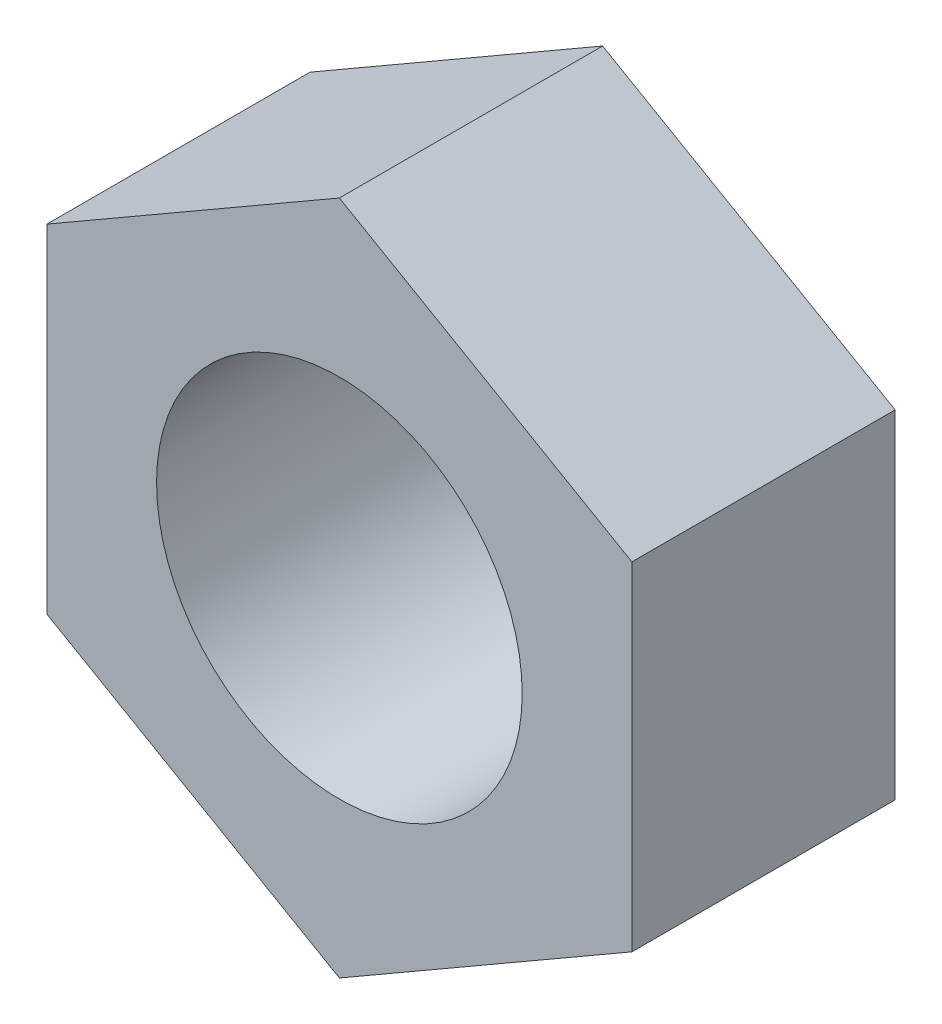
ISO-10303-21;
HEADER;
FILE_DESCRIPTION(('STEP AP214'),'2;1');
FILE_NAME('part.step','',(''),(''),'','','');
FILE_SCHEMA(('AUTOMOTIVE_DESIGN { 1 0 10303 214 1 1 1 1 }'));
ENDSEC;
DATA;
#1=APPLICATION_CONTEXT('core data for automotive mechanical design processes');
#2=APPLICATION_PROTOCOL_DEFINITION('international standard','automotive_design',2000,#1);
#3=PRODUCT_CONTEXT('',#1,'mechanical');
#4=PRODUCT('Part','Part','',(#3));
#5=PRODUCT_RELATED_PRODUCT_CATEGORY('part','',(#4));
#6=PRODUCT_DEFINITION_FORMATION('','',#4);
#7=PRODUCT_DEFINITION_CONTEXT('part definition',#1,'design');
#8=PRODUCT_DEFINITION('design','',#6,#7);
#9=PRODUCT_DEFINITION_SHAPE('','',#8);
#10=(LENGTH_UNIT() NAMED_UNIT(*) SI_UNIT(.MILLI.,.METRE.));
#11=(NAMED_UNIT(*) PLANE_ANGLE_UNIT() SI_UNIT($,.RADIAN.));
#12=(NAMED_UNIT(*) SI_UNIT($,.STERADIAN.) SOLID_ANGLE_UNIT());
#13=UNCERTAINTY_MEASURE_WITH_UNIT(LENGTH_MEASURE(1.E-05),#10,'distance_accuracy_value','');
#14=(GEOMETRIC_REPRESENTATION_CONTEXT(3) GLOBAL_UNCERTAINTY_ASSIGNED_CONTEXT((#13)) GLOBAL_UNIT_ASSIGNED_CONTEXT((#10,
#11,#12)) REPRESENTATION_CONTEXT('',''));
#15=CARTESIAN_POINT('',(0.,0.,0.));
#16=DIRECTION('',(0.,0.,1.));
#17=DIRECTION('',(1.,0.,0.));
#18=AXIS2_PLACEMENT_3D('',#15,#16,#17);
#19=CARTESIAN_POINT('',(-3.99999999999999,6.92820323027551,3.6));
#20=DIRECTION('',(0.,0.,1.));
#21=DIRECTION('',(1.,0.,0.));
#22=AXIS2_PLACEMENT_3D('',#19,#20,#21);
#23=PLANE('',#22);
#24=DIRECTION('',(-0.866025403784439,0.5,0.));
#25=VECTOR('',#24,1.);
#26=CARTESIAN_POINT('',(4.00000000000001,2.3094010767585,3.59999999999999));
#27=LINE('',#26,#25);
#28=CARTESIAN_POINT('',(4.00000000000001,2.3094010767585,3.59999999999999));
#29=VERTEX_POINT('',#28);
#30=CARTESIAN_POINT('',(0.,4.61880215351701,3.6));
#31=VERTEX_POINT('',#30);
#32=EDGE_CURVE('E114',#29,#31,#27,.T.);
#33=ORIENTED_EDGE('',*,*,#32,.T.);
#34=DIRECTION('',(-0.866025403784439,-0.499999999999999,0.));
#35=VECTOR('',#34,1.);
#36=CARTESIAN_POINT('',(0.,4.61880215351701,3.6));
#37=LINE('',#36,#35);
#38=CARTESIAN_POINT('',(-3.99999999999999,2.3094010767585,3.6));
#39=VERTEX_POINT('',#38);
#40=EDGE_CURVE('E95',#31,#39,#37,.T.);
#41=ORIENTED_EDGE('',*,*,#40,.T.);
#42=DIRECTION('',(0.,-1.,0.));
#43=VECTOR('',#42,1.);
#44=CARTESIAN_POINT('',(-3.99999999999999,2.3094010767585,3.6));
#45=LINE('',#44,#43);
#46=CARTESIAN_POINT('',(-3.99999999999999,-2.3094010767585,3.6));
#47=VERTEX_POINT('',#46);
#48=EDGE_CURVE('E117',#39,#47,#45,.T.);
#49=ORIENTED_EDGE('',*,*,#48,.T.);
#50=DIRECTION('',(0.866025403784438,-0.5,0.));
#51=VECTOR('',#50,1.);
#52=CARTESIAN_POINT('',(-3.99999999999999,-2.3094010767585,3.6));
#53=LINE('',#52,#51);
#54=CARTESIAN_POINT('',(0.,-4.61880215351701,3.6));
#55=VERTEX_POINT('',#54);
#56=EDGE_CURVE('E119',#47,#55,#53,.T.);
#57=ORIENTED_EDGE('',*,*,#56,.T.);
#58=DIRECTION('',(0.866025403784439,0.5,0.));
#59=VECTOR('',#58,1.);
#60=CARTESIAN_POINT('',(0.,-4.61880215351701,3.6));
#61=LINE('',#60,#59);
#62=CARTESIAN_POINT('',(4.00000000000001,-2.3094010767585,3.59999999999999));
#63=VERTEX_POINT('',#62);
#64=EDGE_CURVE('E48',#55,#63,#61,.T.);
#65=ORIENTED_EDGE('',*,*,#64,.T.);
#66=DIRECTION('',(0.,1.,0.));
#67=VECTOR('',#66,1.);
#68=CARTESIAN_POINT('',(4.00000000000001,-2.3094010767585,3.59999999999999));
#69=LINE('',#68,#67);
#70=EDGE_CURVE('E43',#63,#29,#69,.T.);
#71=ORIENTED_EDGE('',*,*,#70,.T.);
#72=EDGE_LOOP('',(#33,#41,#49,#57,#65,#71));
#73=FACE_BOUND('',#72,.T.);
#74=CARTESIAN_POINT('',(0.,0.,3.6));
#75=DIRECTION('',(0.,0.,1.));
#76=DIRECTION('',(1.,0.,0.));
#77=AXIS2_PLACEMENT_3D('',#74,#75,#76);
#78=CIRCLE('',#77,2.5);
#79=CARTESIAN_POINT('',(-2.49999999999999,0.,3.6));
#80=VERTEX_POINT('',#79);
#81=EDGE_CURVE('E100',#80,#80,#78,.T.);
#82=ORIENTED_EDGE('',*,*,#81,.F.);
#83=EDGE_LOOP('',(#82));
#84=FACE_BOUND('',#83,.T.);
#85=ADVANCED_FACE('F28',(#73,#84),#23,.T.);
#86=CARTESIAN_POINT('',(-4.,6.92820323027553,0.));
#87=DIRECTION('',(0.,0.,1.));
#88=DIRECTION('',(1.,0.,0.));
#89=AXIS2_PLACEMENT_3D('',#86,#87,#88);
#90=PLANE('',#89);
#91=DIRECTION('',(-0.866025403784439,0.5,0.));
#92=VECTOR('',#91,1.);
#93=CARTESIAN_POINT('',(4.,2.3094010767585,0.));
#94=LINE('',#93,#92);
#95=CARTESIAN_POINT('',(4.,2.3094010767585,0.));
#96=VERTEX_POINT('',#95);
#97=CARTESIAN_POINT('',(0.,4.61880215351701,0.));
#98=VERTEX_POINT('',#97);
#99=EDGE_CURVE('E86',#96,#98,#94,.T.);
#100=ORIENTED_EDGE('',*,*,#99,.F.);
#101=DIRECTION('',(0.,1.,0.));
#102=VECTOR('',#101,1.);
#103=CARTESIAN_POINT('',(4.00000000000001,-2.3094010767585,0.));
#104=LINE('',#103,#102);
#105=CARTESIAN_POINT('',(4.00000000000001,-2.3094010767585,0.));
#106=VERTEX_POINT('',#105);
#107=EDGE_CURVE('E112',#106,#96,#104,.T.);
#108=ORIENTED_EDGE('',*,*,#107,.F.);
#109=DIRECTION('',(0.866025403784439,0.5,0.));
#110=VECTOR('',#109,1.);
#111=CARTESIAN_POINT('',(0.,-4.61880215351701,0.));
#112=LINE('',#111,#110);
#113=CARTESIAN_POINT('',(0.,-4.61880215351701,0.));
#114=VERTEX_POINT('',#113);
#115=EDGE_CURVE('E110',#114,#106,#112,.T.);
#116=ORIENTED_EDGE('',*,*,#115,.F.);
#117=DIRECTION('',(0.866025403784438,-0.5,0.));
#118=VECTOR('',#117,1.);
#119=CARTESIAN_POINT('',(-4.,-2.3094010767585,0.));
#120=LINE('',#119,#118);
#121=CARTESIAN_POINT('',(-4.,-2.3094010767585,0.));
#122=VERTEX_POINT('',#121);
#123=EDGE_CURVE('E108',#122,#114,#120,.T.);
#124=ORIENTED_EDGE('',*,*,#123,.F.);
#125=DIRECTION('',(0.,-1.,0.));
#126=VECTOR('',#125,1.);
#127=CARTESIAN_POINT('',(-3.99999999999999,2.3094010767585,0.));
#128=LINE('',#127,#126);
#129=CARTESIAN_POINT('',(-3.99999999999999,2.3094010767585,0.));
#130=VERTEX_POINT('',#129);
#131=EDGE_CURVE('E88',#130,#122,#128,.T.);
#132=ORIENTED_EDGE('',*,*,#131,.F.);
#133=DIRECTION('',(-0.866025403784439,-0.499999999999999,0.));
#134=VECTOR('',#133,1.);
#135=CARTESIAN_POINT('',(0.,4.61880215351701,0.));
#136=LINE('',#135,#134);
#137=EDGE_CURVE('E81',#98,#130,#136,.T.);
#138=ORIENTED_EDGE('',*,*,#137,.F.);
#139=EDGE_LOOP('',(#100,#108,#116,#124,#132,#138));
#140=FACE_BOUND('',#139,.T.);
#141=CARTESIAN_POINT('',(0.,0.,0.));
#142=DIRECTION('',(0.,0.,1.));
#143=DIRECTION('',(1.,0.,0.));
#144=AXIS2_PLACEMENT_3D('',#141,#142,#143);
#145=CIRCLE('',#144,2.5);
#146=CARTESIAN_POINT('',(-2.49999999999999,0.,0.));
#147=VERTEX_POINT('',#146);
#148=EDGE_CURVE('E103',#147,#147,#145,.T.);
#149=ORIENTED_EDGE('',*,*,#148,.T.);
#150=EDGE_LOOP('',(#149));
#151=FACE_BOUND('',#150,.T.);
#152=ADVANCED_FACE('F82',(#140,#151),#90,.F.);
#153=CARTESIAN_POINT('',(4.00000000000001,2.3094010767585,3.59999999999999));
#154=DIRECTION('',(-0.5,-0.866025403784438,0.));
#155=DIRECTION('',(0.866025403784439,-0.5,0.));
#156=AXIS2_PLACEMENT_3D('',#153,#154,#155);
#157=PLANE('',#156);
#158=ORIENTED_EDGE('',*,*,#99,.T.);
#159=DIRECTION('',(0.,0.,-1.));
#160=VECTOR('',#159,1.);
#161=CARTESIAN_POINT('',(0.,4.61880215351701,3.6));
#162=LINE('',#161,#160);
#163=EDGE_CURVE('E11',#31,#98,#162,.T.);
#164=ORIENTED_EDGE('',*,*,#163,.F.);
#165=ORIENTED_EDGE('',*,*,#32,.F.);
#166=DIRECTION('',(0.,0.,-1.));
#167=VECTOR('',#166,1.);
#168=CARTESIAN_POINT('',(4.00000000000001,2.3094010767585,3.59999999999999));
#169=LINE('',#168,#167);
#170=EDGE_CURVE('E99',#29,#96,#169,.T.);
#171=ORIENTED_EDGE('',*,*,#170,.T.);
#172=EDGE_LOOP('',(#158,#164,#165,#171));
#173=FACE_BOUND('',#172,.T.);
#174=ADVANCED_FACE('F30',(#173),#157,.F.);
#175=CARTESIAN_POINT('',(0.,4.61880215351701,3.6));
#176=DIRECTION('',(0.5,-0.866025403784438,0.));
#177=DIRECTION('',(0.866025403784439,0.499999999999999,0.));
#178=AXIS2_PLACEMENT_3D('',#175,#176,#177);
#179=PLANE('',#178);
#180=ORIENTED_EDGE('',*,*,#137,.T.);
#181=DIRECTION('',(0.,0.,-1.));
#182=VECTOR('',#181,1.);
#183=CARTESIAN_POINT('',(-3.99999999999999,2.3094010767585,3.6));
#184=LINE('',#183,#182);
#185=EDGE_CURVE('E36',#39,#130,#184,.T.);
#186=ORIENTED_EDGE('',*,*,#185,.F.);
#187=ORIENTED_EDGE('',*,*,#40,.F.);
#188=ORIENTED_EDGE('',*,*,#163,.T.);
#189=EDGE_LOOP('',(#180,#186,#187,#188));
#190=FACE_BOUND('',#189,.T.);
#191=ADVANCED_FACE('F94',(#190),#179,.F.);
#192=CARTESIAN_POINT('',(-3.99999999999999,2.3094010767585,3.6));
#193=DIRECTION('',(1.,0.,0.));
#194=DIRECTION('',(0.,0.,-1.));
#195=AXIS2_PLACEMENT_3D('',#192,#193,#194);
#196=PLANE('',#195);
#197=ORIENTED_EDGE('',*,*,#131,.T.);
#198=DIRECTION('',(0.,0.,-1.));
#199=VECTOR('',#198,1.);
#200=CARTESIAN_POINT('',(-3.99999999999999,-2.3094010767585,3.6));
#201=LINE('',#200,#199);
#202=EDGE_CURVE('E130',#47,#122,#201,.T.);
#203=ORIENTED_EDGE('',*,*,#202,.F.);
#204=ORIENTED_EDGE('',*,*,#48,.F.);
#205=ORIENTED_EDGE('',*,*,#185,.T.);
#206=EDGE_LOOP('',(#197,#203,#204,#205));
#207=FACE_BOUND('',#206,.T.);
#208=ADVANCED_FACE('F134',(#207),#196,.F.);
#209=CARTESIAN_POINT('',(-3.99999999999999,-2.3094010767585,3.6));
#210=DIRECTION('',(0.5,0.866025403784438,0.));
#211=DIRECTION('',(-0.866025403784439,0.5,0.));
#212=AXIS2_PLACEMENT_3D('',#209,#210,#211);
#213=PLANE('',#212);
#214=ORIENTED_EDGE('',*,*,#123,.T.);
#215=DIRECTION('',(0.,0.,-1.));
#216=VECTOR('',#215,1.);
#217=CARTESIAN_POINT('',(0.,-4.61880215351701,3.6));
#218=LINE('',#217,#216);
#219=EDGE_CURVE('E127',#55,#114,#218,.T.);
#220=ORIENTED_EDGE('',*,*,#219,.F.);
#221=ORIENTED_EDGE('',*,*,#56,.F.);
#222=ORIENTED_EDGE('',*,*,#202,.T.);
#223=EDGE_LOOP('',(#214,#220,#221,#222));
#224=FACE_BOUND('',#223,.T.);
#225=ADVANCED_FACE('F140',(#224),#213,.F.);
#226=CARTESIAN_POINT('',(0.,-4.61880215351701,3.6));
#227=DIRECTION('',(-0.5,0.866025403784438,0.));
#228=DIRECTION('',(-0.866025403784439,-0.5,0.));
#229=AXIS2_PLACEMENT_3D('',#226,#227,#228);
#230=PLANE('',#229);
#231=ORIENTED_EDGE('',*,*,#115,.T.);
#232=DIRECTION('',(0.,0.,-1.));
#233=VECTOR('',#232,1.);
#234=CARTESIAN_POINT('',(4.00000000000001,-2.3094010767585,3.59999999999999));
#235=LINE('',#234,#233);
#236=EDGE_CURVE('E124',#63,#106,#235,.T.);
#237=ORIENTED_EDGE('',*,*,#236,.F.);
#238=ORIENTED_EDGE('',*,*,#64,.F.);
#239=ORIENTED_EDGE('',*,*,#219,.T.);
#240=EDGE_LOOP('',(#231,#237,#238,#239));
#241=FACE_BOUND('',#240,.T.);
#242=ADVANCED_FACE('F143',(#241),#230,.F.);
#243=CARTESIAN_POINT('',(4.00000000000001,-2.3094010767585,3.59999999999999));
#244=DIRECTION('',(-1.,0.,0.));
#245=DIRECTION('',(0.,0.,1.));
#246=AXIS2_PLACEMENT_3D('',#243,#244,#245);
#247=PLANE('',#246);
#248=ORIENTED_EDGE('',*,*,#107,.T.);
#249=ORIENTED_EDGE('',*,*,#170,.F.);
#250=ORIENTED_EDGE('',*,*,#70,.F.);
#251=ORIENTED_EDGE('',*,*,#236,.T.);
#252=EDGE_LOOP('',(#248,#249,#250,#251));
#253=FACE_BOUND('',#252,.T.);
#254=ADVANCED_FACE('F145',(#253),#247,.F.);
#255=CARTESIAN_POINT('',(0.,0.,3.6));
#256=DIRECTION('',(0.,0.,-1.));
#257=DIRECTION('',(-1.,0.,0.));
#258=AXIS2_PLACEMENT_3D('',#255,#256,#257);
#259=CYLINDRICAL_SURFACE('',#258,2.5);
#260=CARTESIAN_POINT('',(-2.49999999999999,0.,3.6));
#261=CARTESIAN_POINT('',(-2.49999999999999,0.,3.5625));
#262=CARTESIAN_POINT('',(-2.49999999999999,0.,3.525));
#263=CARTESIAN_POINT('',(-2.49999999999999,0.,3.45));
#264=CARTESIAN_POINT('',(-2.49999999999999,0.,3.4125));
#265=CARTESIAN_POINT('',(-2.49999999999999,0.,3.3375));
#266=CARTESIAN_POINT('',(-2.49999999999999,0.,3.3));
#267=CARTESIAN_POINT('',(-2.49999999999999,0.,3.225));
#268=CARTESIAN_POINT('',(-2.49999999999999,0.,3.1875));
#269=CARTESIAN_POINT('',(-2.49999999999999,0.,3.1125));
#270=CARTESIAN_POINT('',(-2.49999999999999,0.,3.075));
#271=CARTESIAN_POINT('',(-2.49999999999999,0.,3.));
#272=CARTESIAN_POINT('',(-2.49999999999999,0.,2.9625));
#273=CARTESIAN_POINT('',(-2.49999999999999,0.,2.8875));
#274=CARTESIAN_POINT('',(-2.49999999999999,0.,2.85));
#275=CARTESIAN_POINT('',(-2.49999999999999,0.,2.775));
#276=CARTESIAN_POINT('',(-2.49999999999999,0.,2.7375));
#277=CARTESIAN_POINT('',(-2.49999999999999,0.,2.6625));
#278=CARTESIAN_POINT('',(-2.49999999999999,0.,2.625));
#279=CARTESIAN_POINT('',(-2.49999999999999,0.,2.55));
#280=CARTESIAN_POINT('',(-2.49999999999999,0.,2.5125));
#281=CARTESIAN_POINT('',(-2.49999999999999,0.,2.4375));
#282=CARTESIAN_POINT('',(-2.49999999999999,0.,2.4));
#283=CARTESIAN_POINT('',(-2.49999999999999,0.,2.325));
#284=CARTESIAN_POINT('',(-2.49999999999999,0.,2.2875));
#285=CARTESIAN_POINT('',(-2.49999999999999,0.,2.2125));
#286=CARTESIAN_POINT('',(-2.49999999999999,0.,2.175));
#287=CARTESIAN_POINT('',(-2.49999999999999,0.,2.1));
#288=CARTESIAN_POINT('',(-2.49999999999999,0.,2.0625));
#289=CARTESIAN_POINT('',(-2.49999999999999,0.,1.9875));
#290=CARTESIAN_POINT('',(-2.49999999999999,0.,1.95));
#291=CARTESIAN_POINT('',(-2.49999999999999,0.,1.875));
#292=CARTESIAN_POINT('',(-2.49999999999999,0.,1.8375));
#293=CARTESIAN_POINT('',(-2.49999999999999,0.,1.7625));
#294=CARTESIAN_POINT('',(-2.49999999999999,0.,1.725));
#295=CARTESIAN_POINT('',(-2.49999999999999,0.,1.65));
#296=CARTESIAN_POINT('',(-2.49999999999999,0.,1.6125));
#297=CARTESIAN_POINT('',(-2.49999999999999,0.,1.5375));
#298=CARTESIAN_POINT('',(-2.49999999999999,0.,1.5));
#299=CARTESIAN_POINT('',(-2.49999999999999,0.,1.425));
#300=CARTESIAN_POINT('',(-2.49999999999999,0.,1.3875));
#301=CARTESIAN_POINT('',(-2.49999999999999,0.,1.3125));
#302=CARTESIAN_POINT('',(-2.49999999999999,0.,1.275));
#303=CARTESIAN_POINT('',(-2.49999999999999,0.,1.2));
#304=CARTESIAN_POINT('',(-2.49999999999999,0.,1.1625));
#305=CARTESIAN_POINT('',(-2.49999999999999,0.,1.0875));
#306=CARTESIAN_POINT('',(-2.49999999999999,0.,1.05));
#307=CARTESIAN_POINT('',(-2.49999999999999,0.,0.974999999999999));
#308=CARTESIAN_POINT('',(-2.49999999999999,0.,0.937499999999999));
#309=CARTESIAN_POINT('',(-2.49999999999999,0.,0.862499999999999));
#310=CARTESIAN_POINT('',(-2.49999999999999,0.,0.824999999999999));
#311=CARTESIAN_POINT('',(-2.49999999999999,0.,0.749999999999999));
#312=CARTESIAN_POINT('',(-2.49999999999999,0.,0.712499999999999));
#313=CARTESIAN_POINT('',(-2.49999999999999,0.,0.637499999999999));
#314=CARTESIAN_POINT('',(-2.49999999999999,0.,0.599999999999999));
#315=CARTESIAN_POINT('',(-2.49999999999999,0.,0.524999999999999));
#316=CARTESIAN_POINT('',(-2.49999999999999,0.,0.487499999999999));
#317=CARTESIAN_POINT('',(-2.49999999999999,0.,0.412499999999999));
#318=CARTESIAN_POINT('',(-2.49999999999999,0.,0.374999999999999));
#319=CARTESIAN_POINT('',(-2.49999999999999,0.,0.299999999999999));
#320=CARTESIAN_POINT('',(-2.49999999999999,0.,0.262499999999999));
#321=CARTESIAN_POINT('',(-2.49999999999999,0.,0.1875));
#322=CARTESIAN_POINT('',(-2.49999999999999,0.,0.15));
#323=CARTESIAN_POINT('',(-2.49999999999999,0.,0.0749999999999998));
#324=CARTESIAN_POINT('',(-2.49999999999999,0.,0.0375));
#325=CARTESIAN_POINT('',(-2.49999999999999,0.,0.));
#326=B_SPLINE_CURVE_WITH_KNOTS('',3,(#260,#261,#262,#263,#264,#265,#266,#267,#268,#269,#270,
#271,#272,#273,#274,#275,#276,#277,#278,#279,#280,#281,#282,#283,#284,#285,#286,#287,#288,#289,
#290,#291,#292,#293,#294,#295,#296,#297,#298,#299,#300,#301,#302,#303,#304,#305,#306,#307,#308,
#309,#310,#311,#312,#313,#314,#315,#316,#317,#318,#319,#320,#321,#322,#323,#324,#325),
.UNSPECIFIED.,.F.,.F.,(4,2,2,2,2,2,2,2,2,2,2,2,2,2,2,2,2,2,2,2,2,2,2,2,2,2,2,2,2,2,2,2,4),(0.,
0.1125,0.225,0.3375,0.45,0.5625,0.674999999999999,0.787499999999999,0.899999999999999,1.0125,
1.125,1.2375,1.35,1.4625,1.575,1.6875,1.8,1.9125,2.025,2.1375,2.25,2.3625,2.475,2.5875,2.7,
2.8125,2.925,3.0375,3.15,3.2625,3.375,3.4875,3.6),.UNSPECIFIED.);
#327=EDGE_CURVE('BSEAM147',#80,#147,#326,.T.);
#328=ORIENTED_EDGE('',*,*,#81,.T.);
#329=ORIENTED_EDGE('',*,*,#148,.F.);
#330=ORIENTED_EDGE('',*,*,#327,.T.);
#331=ORIENTED_EDGE('',*,*,#327,.F.);
#332=EDGE_LOOP('',(#328,#330,#329,#331));
#333=FACE_BOUND('',#332,.T.);
#334=ADVANCED_FACE('F147',(#333),#259,.F.);
#335=CLOSED_SHELL('',(#85,#152,#174,#191,#208,#225,#242,#254,#334));
#336=MANIFOLD_SOLID_BREP('B2',#335);
#337=ADVANCED_BREP_SHAPE_REPRESENTATION('',(#18,#336),#14);
#338=SHAPE_DEFINITION_REPRESENTATION(#9,#337);
ENDSEC;
END-ISO-10303-21;
